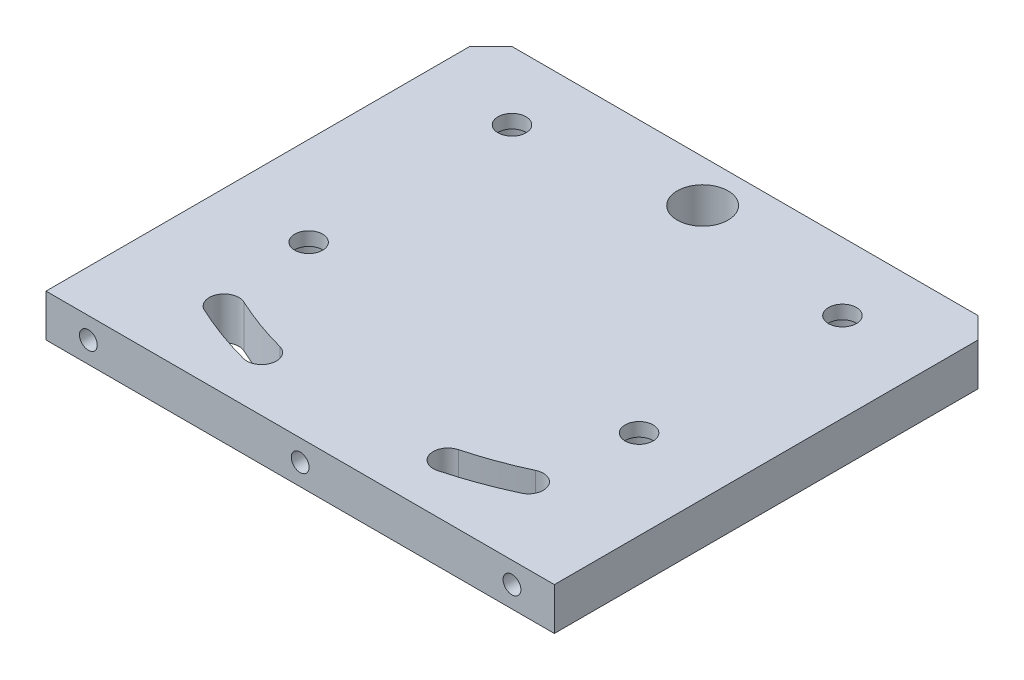
ISO-10303-21;
HEADER;
FILE_DESCRIPTION(('STEP AP214'),'2;1');
FILE_NAME('part.step','',(''),(''),'','','');
FILE_SCHEMA(('AUTOMOTIVE_DESIGN { 1 0 10303 214 1 1 1 1 }'));
ENDSEC;
DATA;
#1=APPLICATION_CONTEXT('core data for automotive mechanical design processes');
#2=APPLICATION_PROTOCOL_DEFINITION('international standard','automotive_design',2000,#1);
#3=PRODUCT_CONTEXT('',#1,'mechanical');
#4=PRODUCT('Part','Part','',(#3));
#5=PRODUCT_RELATED_PRODUCT_CATEGORY('part','',(#4));
#6=PRODUCT_DEFINITION_FORMATION('','',#4);
#7=PRODUCT_DEFINITION_CONTEXT('part definition',#1,'design');
#8=PRODUCT_DEFINITION('design','',#6,#7);
#9=PRODUCT_DEFINITION_SHAPE('','',#8);
#10=(LENGTH_UNIT() NAMED_UNIT(*) SI_UNIT(.MILLI.,.METRE.));
#11=(NAMED_UNIT(*) PLANE_ANGLE_UNIT() SI_UNIT($,.RADIAN.));
#12=(NAMED_UNIT(*) SI_UNIT($,.STERADIAN.) SOLID_ANGLE_UNIT());
#13=UNCERTAINTY_MEASURE_WITH_UNIT(LENGTH_MEASURE(1.E-05),#10,'distance_accuracy_value','');
#14=(GEOMETRIC_REPRESENTATION_CONTEXT(3) GLOBAL_UNCERTAINTY_ASSIGNED_CONTEXT((#13)) GLOBAL_UNIT_ASSIGNED_CONTEXT((#10,
#11,#12)) REPRESENTATION_CONTEXT('',''));
#15=CARTESIAN_POINT('',(0.,0.,0.));
#16=DIRECTION('',(0.,0.,1.));
#17=DIRECTION('',(1.,0.,0.));
#18=AXIS2_PLACEMENT_3D('',#15,#16,#17);
#19=CARTESIAN_POINT('',(60.,10.,52.5));
#20=DIRECTION('',(-1.,0.,0.));
#21=DIRECTION('',(0.,0.,1.));
#22=AXIS2_PLACEMENT_3D('',#19,#20,#21);
#23=PLANE('',#22);
#24=DIRECTION('',(0.,0.,-1.));
#25=VECTOR('',#24,1.);
#26=CARTESIAN_POINT('',(60.,0.,52.5));
#27=LINE('',#26,#25);
#28=CARTESIAN_POINT('',(60.,0.,52.5));
#29=VERTEX_POINT('',#28);
#30=CARTESIAN_POINT('',(60.,0.,-47.5));
#31=VERTEX_POINT('',#30);
#32=EDGE_CURVE('E294',#29,#31,#27,.T.);
#33=ORIENTED_EDGE('',*,*,#32,.T.);
#34=DIRECTION('',(0.,1.,0.));
#35=VECTOR('',#34,1.);
#36=CARTESIAN_POINT('',(60.,10.,-47.5));
#37=LINE('',#36,#35);
#38=CARTESIAN_POINT('',(60.,10.,-47.5));
#39=VERTEX_POINT('',#38);
#40=EDGE_CURVE('E11',#31,#39,#37,.T.);
#41=ORIENTED_EDGE('',*,*,#40,.T.);
#42=DIRECTION('',(0.,0.,-1.));
#43=VECTOR('',#42,1.);
#44=CARTESIAN_POINT('',(60.,10.,52.5));
#45=LINE('',#44,#43);
#46=CARTESIAN_POINT('',(60.,10.,52.5));
#47=VERTEX_POINT('',#46);
#48=EDGE_CURVE('E295',#47,#39,#45,.T.);
#49=ORIENTED_EDGE('',*,*,#48,.F.);
#50=DIRECTION('',(0.,-1.,0.));
#51=VECTOR('',#50,1.);
#52=CARTESIAN_POINT('',(60.,10.,52.5));
#53=LINE('',#52,#51);
#54=EDGE_CURVE('E304',#47,#29,#53,.T.);
#55=ORIENTED_EDGE('',*,*,#54,.T.);
#56=EDGE_LOOP('',(#33,#41,#49,#55));
#57=FACE_BOUND('',#56,.T.);
#58=ADVANCED_FACE('F39',(#57),#23,.F.);
#59=CARTESIAN_POINT('',(-60.,10.,-52.5));
#60=DIRECTION('',(0.,0.,1.));
#61=DIRECTION('',(1.,0.,0.));
#62=AXIS2_PLACEMENT_3D('',#59,#60,#61);
#63=PLANE('',#62);
#64=DIRECTION('',(-1.,0.,0.));
#65=VECTOR('',#64,1.);
#66=CARTESIAN_POINT('',(-60.,0.,-52.5));
#67=LINE('',#66,#65);
#68=CARTESIAN_POINT('',(55.,0.,-52.5));
#69=VERTEX_POINT('',#68);
#70=CARTESIAN_POINT('',(-55.,0.,-52.5));
#71=VERTEX_POINT('',#70);
#72=EDGE_CURVE('E306',#69,#71,#67,.T.);
#73=ORIENTED_EDGE('',*,*,#72,.T.);
#74=DIRECTION('',(0.,1.,0.));
#75=VECTOR('',#74,1.);
#76=CARTESIAN_POINT('',(-55.,10.,-52.5));
#77=LINE('',#76,#75);
#78=CARTESIAN_POINT('',(-55.,10.,-52.5));
#79=VERTEX_POINT('',#78);
#80=EDGE_CURVE('E60',#71,#79,#77,.T.);
#81=ORIENTED_EDGE('',*,*,#80,.T.);
#82=DIRECTION('',(-1.,0.,0.));
#83=VECTOR('',#82,1.);
#84=CARTESIAN_POINT('',(-60.,10.,-52.5));
#85=LINE('',#84,#83);
#86=CARTESIAN_POINT('',(55.,10.,-52.5));
#87=VERTEX_POINT('',#86);
#88=EDGE_CURVE('E297',#87,#79,#85,.T.);
#89=ORIENTED_EDGE('',*,*,#88,.F.);
#90=DIRECTION('',(0.,-1.,0.));
#91=VECTOR('',#90,1.);
#92=CARTESIAN_POINT('',(55.,10.,-52.5));
#93=LINE('',#92,#91);
#94=EDGE_CURVE('E323',#87,#69,#93,.T.);
#95=ORIENTED_EDGE('',*,*,#94,.T.);
#96=EDGE_LOOP('',(#73,#81,#89,#95));
#97=FACE_BOUND('',#96,.T.);
#98=ADVANCED_FACE('F344',(#97),#63,.F.);
#99=CARTESIAN_POINT('',(-60.,10.,52.5));
#100=DIRECTION('',(1.,0.,0.));
#101=DIRECTION('',(0.,0.,-1.));
#102=AXIS2_PLACEMENT_3D('',#99,#100,#101);
#103=PLANE('',#102);
#104=DIRECTION('',(0.,0.,1.));
#105=VECTOR('',#104,1.);
#106=CARTESIAN_POINT('',(-60.,10.,52.5));
#107=LINE('',#106,#105);
#108=CARTESIAN_POINT('',(-60.,10.,-47.5));
#109=VERTEX_POINT('',#108);
#110=CARTESIAN_POINT('',(-60.,10.,52.5));
#111=VERTEX_POINT('',#110);
#112=EDGE_CURVE('E300',#109,#111,#107,.T.);
#113=ORIENTED_EDGE('',*,*,#112,.F.);
#114=DIRECTION('',(0.,-1.,0.));
#115=VECTOR('',#114,1.);
#116=CARTESIAN_POINT('',(-60.,10.,-47.5));
#117=LINE('',#116,#115);
#118=CARTESIAN_POINT('',(-60.,0.,-47.5000000000001));
#119=VERTEX_POINT('',#118);
#120=EDGE_CURVE('E316',#109,#119,#117,.T.);
#121=ORIENTED_EDGE('',*,*,#120,.T.);
#122=DIRECTION('',(0.,0.,1.));
#123=VECTOR('',#122,1.);
#124=CARTESIAN_POINT('',(-60.,0.,52.5));
#125=LINE('',#124,#123);
#126=CARTESIAN_POINT('',(-60.,0.,52.5));
#127=VERTEX_POINT('',#126);
#128=EDGE_CURVE('E308',#119,#127,#125,.T.);
#129=ORIENTED_EDGE('',*,*,#128,.T.);
#130=DIRECTION('',(0.,-1.,0.));
#131=VECTOR('',#130,1.);
#132=CARTESIAN_POINT('',(-60.,10.,52.5));
#133=LINE('',#132,#131);
#134=EDGE_CURVE('E313',#111,#127,#133,.T.);
#135=ORIENTED_EDGE('',*,*,#134,.F.);
#136=EDGE_LOOP('',(#113,#121,#129,#135));
#137=FACE_BOUND('',#136,.T.);
#138=ADVANCED_FACE('F336',(#137),#103,.F.);
#139=CARTESIAN_POINT('',(-60.,10.,52.5));
#140=DIRECTION('',(0.,0.,-1.));
#141=DIRECTION('',(-1.,0.,0.));
#142=AXIS2_PLACEMENT_3D('',#139,#140,#141);
#143=PLANE('',#142);
#144=CARTESIAN_POINT('',(-50.,4.99999999999999,52.5));
#145=DIRECTION('',(0.,0.,1.));
#146=DIRECTION('',(1.,0.,0.));
#147=AXIS2_PLACEMENT_3D('',#144,#145,#146);
#148=CIRCLE('',#147,2.09999999999999);
#149=CARTESIAN_POINT('',(-47.9,4.99999999999999,52.5));
#150=VERTEX_POINT('',#149);
#151=EDGE_CURVE('E160',#150,#150,#148,.T.);
#152=ORIENTED_EDGE('',*,*,#151,.F.);
#153=EDGE_LOOP('',(#152));
#154=FACE_BOUND('',#153,.T.);
#155=CARTESIAN_POINT('',(50.,4.99999999999998,52.5));
#156=DIRECTION('',(0.,0.,1.));
#157=DIRECTION('',(1.,0.,0.));
#158=AXIS2_PLACEMENT_3D('',#155,#156,#157);
#159=CIRCLE('',#158,2.09999999999999);
#160=CARTESIAN_POINT('',(52.1,4.99999999999998,52.5));
#161=VERTEX_POINT('',#160);
#162=EDGE_CURVE('E159',#161,#161,#159,.T.);
#163=ORIENTED_EDGE('',*,*,#162,.F.);
#164=EDGE_LOOP('',(#163));
#165=FACE_BOUND('',#164,.T.);
#166=CARTESIAN_POINT('',(0.,4.99999999999999,52.5));
#167=DIRECTION('',(0.,0.,1.));
#168=DIRECTION('',(1.,0.,0.));
#169=AXIS2_PLACEMENT_3D('',#166,#167,#168);
#170=CIRCLE('',#169,2.09999999999999);
#171=CARTESIAN_POINT('',(2.09999999999999,4.99999999999999,52.5));
#172=VERTEX_POINT('',#171);
#173=EDGE_CURVE('E170',#172,#172,#170,.T.);
#174=ORIENTED_EDGE('',*,*,#173,.F.);
#175=EDGE_LOOP('',(#174));
#176=FACE_BOUND('',#175,.T.);
#177=DIRECTION('',(1.,0.,0.));
#178=VECTOR('',#177,1.);
#179=CARTESIAN_POINT('',(-60.,0.,52.5));
#180=LINE('',#179,#178);
#181=EDGE_CURVE('E298',#127,#29,#180,.T.);
#182=ORIENTED_EDGE('',*,*,#181,.T.);
#183=ORIENTED_EDGE('',*,*,#54,.F.);
#184=DIRECTION('',(1.,0.,0.));
#185=VECTOR('',#184,1.);
#186=CARTESIAN_POINT('',(-60.,10.,52.5));
#187=LINE('',#186,#185);
#188=EDGE_CURVE('E302',#111,#47,#187,.T.);
#189=ORIENTED_EDGE('',*,*,#188,.F.);
#190=ORIENTED_EDGE('',*,*,#134,.T.);
#191=EDGE_LOOP('',(#182,#183,#189,#190));
#192=FACE_BOUND('',#191,.T.);
#193=ADVANCED_FACE('F351',(#154,#165,#176,#192),#143,.F.);
#194=CARTESIAN_POINT('',(0.,10.,0.));
#195=DIRECTION('',(0.,-1.,0.));
#196=DIRECTION('',(0.,0.,-1.));
#197=AXIS2_PLACEMENT_3D('',#194,#195,#196);
#198=PLANE('',#197);
#199=CARTESIAN_POINT('',(21.9996188337143,10.,39.6036952345708));
#200=DIRECTION('',(0.,1.,0.));
#201=DIRECTION('',(0.,0.,1.));
#202=AXIS2_PLACEMENT_3D('',#199,#200,#201);
#203=CIRCLE('',#202,3.5);
#204=CARTESIAN_POINT('',(21.0937521758555,10.,36.222954842559));
#205=VERTEX_POINT('',#204);
#206=CARTESIAN_POINT('',(22.9054854915731,10.,42.9844356265825));
#207=VERTEX_POINT('',#206);
#208=EDGE_CURVE('E187',#205,#207,#203,.T.);
#209=ORIENTED_EDGE('',*,*,#208,.F.);
#210=CARTESIAN_POINT('',(0.,10.,-42.5));
#211=DIRECTION('',(0.,-1.,0.));
#212=DIRECTION('',(0.,0.,-1.));
#213=AXIS2_PLACEMENT_3D('',#210,#211,#212);
#214=CIRCLE('',#213,81.5);
#215=CARTESIAN_POINT('',(34.4433883318671,10.,31.3640846434869));
#216=VERTEX_POINT('',#215);
#217=EDGE_CURVE('E185',#216,#205,#214,.T.);
#218=ORIENTED_EDGE('',*,*,#217,.F.);
#219=CARTESIAN_POINT('',(35.9225522479595,10.,34.5361618981152));
#220=DIRECTION('',(0.,1.,0.));
#221=DIRECTION('',(0.,0.,-1.));
#222=AXIS2_PLACEMENT_3D('',#219,#220,#221);
#223=CIRCLE('',#222,3.5);
#224=CARTESIAN_POINT('',(37.401716164052,10.,37.7082391527435));
#225=VERTEX_POINT('',#224);
#226=EDGE_CURVE('E193',#225,#216,#223,.T.);
#227=ORIENTED_EDGE('',*,*,#226,.F.);
#228=CARTESIAN_POINT('',(0.,10.,-42.5));
#229=DIRECTION('',(0.,1.,0.));
#230=DIRECTION('',(0.,0.,-1.));
#231=AXIS2_PLACEMENT_3D('',#228,#229,#230);
#232=CIRCLE('',#231,88.5);
#233=EDGE_CURVE('E190',#207,#225,#232,.T.);
#234=ORIENTED_EDGE('',*,*,#233,.F.);
#235=EDGE_LOOP('',(#209,#218,#227,#234));
#236=FACE_BOUND('',#235,.T.);
#237=CARTESIAN_POINT('',(0.,10.,-42.5));
#238=DIRECTION('',(0.,-1.,0.));
#239=DIRECTION('',(0.,0.,1.));
#240=AXIS2_PLACEMENT_3D('',#237,#238,#239);
#241=CIRCLE('',#240,81.5);
#242=CARTESIAN_POINT('',(-21.0937521758555,10.,36.222954842559));
#243=VERTEX_POINT('',#242);
#244=CARTESIAN_POINT('',(-34.4433883318671,10.,31.3640846434869));
#245=VERTEX_POINT('',#244);
#246=EDGE_CURVE('E219',#243,#245,#241,.T.);
#247=ORIENTED_EDGE('',*,*,#246,.F.);
#248=CARTESIAN_POINT('',(-21.9996188337143,10.,39.6036952345708));
#249=DIRECTION('',(0.,1.,0.));
#250=DIRECTION('',(0.,0.,-1.));
#251=AXIS2_PLACEMENT_3D('',#248,#249,#250);
#252=CIRCLE('',#251,3.5);
#253=CARTESIAN_POINT('',(-22.9054854915732,10.,42.9844356265825));
#254=VERTEX_POINT('',#253);
#255=EDGE_CURVE('E217',#254,#243,#252,.T.);
#256=ORIENTED_EDGE('',*,*,#255,.F.);
#257=CARTESIAN_POINT('',(0.,10.,-42.5));
#258=DIRECTION('',(0.,1.,0.));
#259=DIRECTION('',(0.,0.,1.));
#260=AXIS2_PLACEMENT_3D('',#257,#258,#259);
#261=CIRCLE('',#260,88.5);
#262=CARTESIAN_POINT('',(-37.401716164052,10.,37.7082391527435));
#263=VERTEX_POINT('',#262);
#264=EDGE_CURVE('E225',#263,#254,#261,.T.);
#265=ORIENTED_EDGE('',*,*,#264,.F.);
#266=CARTESIAN_POINT('',(-35.9225522479595,10.,34.5361618981152));
#267=DIRECTION('',(0.,1.,0.));
#268=DIRECTION('',(0.,0.,1.));
#269=AXIS2_PLACEMENT_3D('',#266,#267,#268);
#270=CIRCLE('',#269,3.5);
#271=EDGE_CURVE('E222',#245,#263,#270,.T.);
#272=ORIENTED_EDGE('',*,*,#271,.F.);
#273=EDGE_LOOP('',(#247,#256,#265,#272));
#274=FACE_BOUND('',#273,.T.);
#275=CARTESIAN_POINT('',(0.,10.,-42.5));
#276=DIRECTION('',(0.,1.,0.));
#277=DIRECTION('',(0.,0.,1.));
#278=AXIS2_PLACEMENT_3D('',#275,#276,#277);
#279=CIRCLE('',#278,6.00000000000001);
#280=CARTESIAN_POINT('',(0.,10.,-36.5));
#281=VERTEX_POINT('',#280);
#282=EDGE_CURVE('E240',#281,#281,#279,.T.);
#283=ORIENTED_EDGE('',*,*,#282,.F.);
#284=EDGE_LOOP('',(#283));
#285=FACE_BOUND('',#284,.T.);
#286=CARTESIAN_POINT('',(-39.,10.,11.5));
#287=DIRECTION('',(0.,-1.,0.));
#288=DIRECTION('',(0.,0.,-1.));
#289=AXIS2_PLACEMENT_3D('',#286,#287,#288);
#290=CIRCLE('',#289,3.3);
#291=CARTESIAN_POINT('',(-39.,10.,8.2));
#292=VERTEX_POINT('',#291);
#293=EDGE_CURVE('E255',#292,#292,#290,.T.);
#294=ORIENTED_EDGE('',*,*,#293,.T.);
#295=EDGE_LOOP('',(#294));
#296=FACE_BOUND('',#295,.T.);
#297=CARTESIAN_POINT('',(39.,10.,11.5));
#298=DIRECTION('',(0.,-1.,0.));
#299=DIRECTION('',(0.,0.,-1.));
#300=AXIS2_PLACEMENT_3D('',#297,#298,#299);
#301=CIRCLE('',#300,3.3);
#302=CARTESIAN_POINT('',(39.,10.,8.20000000000001));
#303=VERTEX_POINT('',#302);
#304=EDGE_CURVE('E267',#303,#303,#301,.T.);
#305=ORIENTED_EDGE('',*,*,#304,.T.);
#306=EDGE_LOOP('',(#305));
#307=FACE_BOUND('',#306,.T.);
#308=CARTESIAN_POINT('',(39.,10.,-36.5));
#309=DIRECTION('',(0.,-1.,0.));
#310=DIRECTION('',(0.,0.,-1.));
#311=AXIS2_PLACEMENT_3D('',#308,#309,#310);
#312=CIRCLE('',#311,3.3);
#313=CARTESIAN_POINT('',(39.,10.,-39.8));
#314=VERTEX_POINT('',#313);
#315=EDGE_CURVE('E279',#314,#314,#312,.T.);
#316=ORIENTED_EDGE('',*,*,#315,.T.);
#317=EDGE_LOOP('',(#316));
#318=FACE_BOUND('',#317,.T.);
#319=CARTESIAN_POINT('',(-39.,10.,-36.5));
#320=DIRECTION('',(0.,-1.,0.));
#321=DIRECTION('',(0.,0.,-1.));
#322=AXIS2_PLACEMENT_3D('',#319,#320,#321);
#323=CIRCLE('',#322,3.3);
#324=CARTESIAN_POINT('',(-39.,10.,-39.8));
#325=VERTEX_POINT('',#324);
#326=EDGE_CURVE('E291',#325,#325,#323,.T.);
#327=ORIENTED_EDGE('',*,*,#326,.T.);
#328=EDGE_LOOP('',(#327));
#329=FACE_BOUND('',#328,.T.);
#330=ORIENTED_EDGE('',*,*,#88,.T.);
#331=DIRECTION('',(0.707106781186548,0.,-0.707106781186547));
#332=VECTOR('',#331,1.);
#333=CARTESIAN_POINT('',(-60.,10.,-47.5));
#334=LINE('',#333,#332);
#335=EDGE_CURVE('E47',#79,#109,#334,.F.);
#336=ORIENTED_EDGE('',*,*,#335,.T.);
#337=ORIENTED_EDGE('',*,*,#112,.T.);
#338=ORIENTED_EDGE('',*,*,#188,.T.);
#339=ORIENTED_EDGE('',*,*,#48,.T.);
#340=DIRECTION('',(0.707106781186547,0.,0.707106781186549));
#341=VECTOR('',#340,1.);
#342=CARTESIAN_POINT('',(55.,10.,-52.5));
#343=LINE('',#342,#341);
#344=EDGE_CURVE('E327',#39,#87,#343,.F.);
#345=ORIENTED_EDGE('',*,*,#344,.T.);
#346=EDGE_LOOP('',(#330,#336,#337,#338,#339,#345));
#347=FACE_BOUND('',#346,.T.);
#348=ADVANCED_FACE('F331',(#236,#274,#285,#296,#307,#318,#329,#347),#198,.F.);
#349=CARTESIAN_POINT('',(0.,0.,0.));
#350=DIRECTION('',(0.,-1.,0.));
#351=DIRECTION('',(0.,0.,-1.));
#352=AXIS2_PLACEMENT_3D('',#349,#350,#351);
#353=PLANE('',#352);
#354=CARTESIAN_POINT('',(0.,0.,-42.5));
#355=DIRECTION('',(0.,-1.,0.));
#356=DIRECTION('',(0.,0.,-1.));
#357=AXIS2_PLACEMENT_3D('',#354,#355,#356);
#358=CIRCLE('',#357,81.5);
#359=CARTESIAN_POINT('',(34.4433883318671,0.,31.3640846434869));
#360=VERTEX_POINT('',#359);
#361=CARTESIAN_POINT('',(21.0937521758555,0.,36.222954842559));
#362=VERTEX_POINT('',#361);
#363=EDGE_CURVE('E182',#360,#362,#358,.T.);
#364=ORIENTED_EDGE('',*,*,#363,.T.);
#365=CARTESIAN_POINT('',(21.9996188337143,0.,39.6036952345708));
#366=DIRECTION('',(0.,-1.,0.));
#367=DIRECTION('',(0.,0.,-1.));
#368=AXIS2_PLACEMENT_3D('',#365,#366,#367);
#369=CIRCLE('',#368,3.5);
#370=CARTESIAN_POINT('',(22.9054854915731,0.,42.9844356265825));
#371=VERTEX_POINT('',#370);
#372=EDGE_CURVE('E199',#362,#371,#369,.F.);
#373=ORIENTED_EDGE('',*,*,#372,.T.);
#374=CARTESIAN_POINT('',(0.,0.,-42.5));
#375=DIRECTION('',(0.,-1.,0.));
#376=DIRECTION('',(0.,0.,-1.));
#377=AXIS2_PLACEMENT_3D('',#374,#375,#376);
#378=CIRCLE('',#377,88.5);
#379=CARTESIAN_POINT('',(37.401716164052,0.,37.7082391527435));
#380=VERTEX_POINT('',#379);
#381=EDGE_CURVE('E176',#371,#380,#378,.F.);
#382=ORIENTED_EDGE('',*,*,#381,.T.);
#383=CARTESIAN_POINT('',(35.9225522479595,0.,34.5361618981152));
#384=DIRECTION('',(0.,-1.,0.));
#385=DIRECTION('',(0.,0.,-1.));
#386=AXIS2_PLACEMENT_3D('',#383,#384,#385);
#387=CIRCLE('',#386,3.5);
#388=EDGE_CURVE('E179',#380,#360,#387,.F.);
#389=ORIENTED_EDGE('',*,*,#388,.T.);
#390=EDGE_LOOP('',(#364,#373,#382,#389));
#391=FACE_BOUND('',#390,.T.);
#392=CARTESIAN_POINT('',(-21.9996188337143,0.,39.6036952345708));
#393=DIRECTION('',(0.,-1.,0.));
#394=DIRECTION('',(0.,0.,-1.));
#395=AXIS2_PLACEMENT_3D('',#392,#393,#394);
#396=CIRCLE('',#395,3.5);
#397=CARTESIAN_POINT('',(-22.9054854915732,0.,42.9844356265825));
#398=VERTEX_POINT('',#397);
#399=CARTESIAN_POINT('',(-21.0937521758555,0.,36.222954842559));
#400=VERTEX_POINT('',#399);
#401=EDGE_CURVE('E214',#398,#400,#396,.F.);
#402=ORIENTED_EDGE('',*,*,#401,.T.);
#403=CARTESIAN_POINT('',(0.,0.,-42.5));
#404=DIRECTION('',(0.,-1.,0.));
#405=DIRECTION('',(0.,0.,-1.));
#406=AXIS2_PLACEMENT_3D('',#403,#404,#405);
#407=CIRCLE('',#406,81.5);
#408=CARTESIAN_POINT('',(-34.4433883318671,0.,31.3640846434869));
#409=VERTEX_POINT('',#408);
#410=EDGE_CURVE('E231',#400,#409,#407,.T.);
#411=ORIENTED_EDGE('',*,*,#410,.T.);
#412=CARTESIAN_POINT('',(-35.9225522479595,0.,34.5361618981152));
#413=DIRECTION('',(0.,-1.,0.));
#414=DIRECTION('',(0.,0.,-1.));
#415=AXIS2_PLACEMENT_3D('',#412,#413,#414);
#416=CIRCLE('',#415,3.5);
#417=CARTESIAN_POINT('',(-37.401716164052,0.,37.7082391527435));
#418=VERTEX_POINT('',#417);
#419=EDGE_CURVE('E208',#409,#418,#416,.F.);
#420=ORIENTED_EDGE('',*,*,#419,.T.);
#421=CARTESIAN_POINT('',(0.,0.,-42.5));
#422=DIRECTION('',(0.,-1.,0.));
#423=DIRECTION('',(0.,0.,-1.));
#424=AXIS2_PLACEMENT_3D('',#421,#422,#423);
#425=CIRCLE('',#424,88.5);
#426=EDGE_CURVE('E211',#418,#398,#425,.F.);
#427=ORIENTED_EDGE('',*,*,#426,.T.);
#428=EDGE_LOOP('',(#402,#411,#420,#427));
#429=FACE_BOUND('',#428,.T.);
#430=CARTESIAN_POINT('',(0.,0.,-42.5));
#431=DIRECTION('',(0.,1.,0.));
#432=DIRECTION('',(0.,0.,1.));
#433=AXIS2_PLACEMENT_3D('',#430,#431,#432);
#434=CIRCLE('',#433,6.00000000000001);
#435=CARTESIAN_POINT('',(0.,0.,-36.5));
#436=VERTEX_POINT('',#435);
#437=EDGE_CURVE('E243',#436,#436,#434,.T.);
#438=ORIENTED_EDGE('',*,*,#437,.T.);
#439=EDGE_LOOP('',(#438));
#440=FACE_BOUND('',#439,.T.);
#441=CARTESIAN_POINT('',(-39.,0.,11.5));
#442=DIRECTION('',(0.,-1.,0.));
#443=DIRECTION('',(0.,0.,-1.));
#444=AXIS2_PLACEMENT_3D('',#441,#442,#443);
#445=CIRCLE('',#444,5.5);
#446=CARTESIAN_POINT('',(-39.,0.,6.));
#447=VERTEX_POINT('',#446);
#448=EDGE_CURVE('E246',#447,#447,#445,.T.);
#449=ORIENTED_EDGE('',*,*,#448,.F.);
#450=EDGE_LOOP('',(#449));
#451=FACE_BOUND('',#450,.T.);
#452=CARTESIAN_POINT('',(39.,0.,11.5));
#453=DIRECTION('',(0.,-1.,0.));
#454=DIRECTION('',(0.,0.,-1.));
#455=AXIS2_PLACEMENT_3D('',#452,#453,#454);
#456=CIRCLE('',#455,5.5);
#457=CARTESIAN_POINT('',(39.,0.,6.00000000000001));
#458=VERTEX_POINT('',#457);
#459=EDGE_CURVE('E258',#458,#458,#456,.T.);
#460=ORIENTED_EDGE('',*,*,#459,.F.);
#461=EDGE_LOOP('',(#460));
#462=FACE_BOUND('',#461,.T.);
#463=CARTESIAN_POINT('',(39.,0.,-36.5));
#464=DIRECTION('',(0.,-1.,0.));
#465=DIRECTION('',(0.,0.,-1.));
#466=AXIS2_PLACEMENT_3D('',#463,#464,#465);
#467=CIRCLE('',#466,5.5);
#468=CARTESIAN_POINT('',(39.,0.,-42.));
#469=VERTEX_POINT('',#468);
#470=EDGE_CURVE('E270',#469,#469,#467,.T.);
#471=ORIENTED_EDGE('',*,*,#470,.F.);
#472=EDGE_LOOP('',(#471));
#473=FACE_BOUND('',#472,.T.);
#474=CARTESIAN_POINT('',(-39.,0.,-36.5));
#475=DIRECTION('',(0.,-1.,0.));
#476=DIRECTION('',(0.,0.,-1.));
#477=AXIS2_PLACEMENT_3D('',#474,#475,#476);
#478=CIRCLE('',#477,5.5);
#479=CARTESIAN_POINT('',(-39.,0.,-42.));
#480=VERTEX_POINT('',#479);
#481=EDGE_CURVE('E282',#480,#480,#478,.T.);
#482=ORIENTED_EDGE('',*,*,#481,.F.);
#483=EDGE_LOOP('',(#482));
#484=FACE_BOUND('',#483,.T.);
#485=ORIENTED_EDGE('',*,*,#128,.F.);
#486=DIRECTION('',(-0.707106781186548,0.,0.707106781186547));
#487=VECTOR('',#486,1.);
#488=CARTESIAN_POINT('',(-53.7499999999999,0.,-53.7500000000001));
#489=LINE('',#488,#487);
#490=EDGE_CURVE('E321',#119,#71,#489,.F.);
#491=ORIENTED_EDGE('',*,*,#490,.T.);
#492=ORIENTED_EDGE('',*,*,#72,.F.);
#493=DIRECTION('',(-0.707106781186547,0.,-0.707106781186549));
#494=VECTOR('',#493,1.);
#495=CARTESIAN_POINT('',(53.7500000000001,0.,-53.7499999999999));
#496=LINE('',#495,#494);
#497=EDGE_CURVE('E319',#69,#31,#496,.F.);
#498=ORIENTED_EDGE('',*,*,#497,.T.);
#499=ORIENTED_EDGE('',*,*,#32,.F.);
#500=ORIENTED_EDGE('',*,*,#181,.F.);
#501=EDGE_LOOP('',(#485,#491,#492,#498,#499,#500));
#502=FACE_BOUND('',#501,.T.);
#503=ADVANCED_FACE('F342',(#391,#429,#440,#451,#462,#473,#484,#502),#353,.T.);
#504=CARTESIAN_POINT('',(-39.,0.,-36.5));
#505=DIRECTION('',(0.,-1.,0.));
#506=DIRECTION('',(0.,0.,-1.));
#507=AXIS2_PLACEMENT_3D('',#504,#505,#506);
#508=CYLINDRICAL_SURFACE('',#507,3.3);
#509=ORIENTED_EDGE('',*,*,#326,.F.);
#510=EDGE_LOOP('',(#509));
#511=FACE_BOUND('',#510,.T.);
#512=CARTESIAN_POINT('',(-39.,6.8,-36.5));
#513=DIRECTION('',(0.,-1.,0.));
#514=DIRECTION('',(0.,0.,-1.));
#515=AXIS2_PLACEMENT_3D('',#512,#513,#514);
#516=CIRCLE('',#515,3.3);
#517=CARTESIAN_POINT('',(-39.,6.8,-39.8));
#518=VERTEX_POINT('',#517);
#519=EDGE_CURVE('E288',#518,#518,#516,.T.);
#520=ORIENTED_EDGE('',*,*,#519,.T.);
#521=EDGE_LOOP('',(#520));
#522=FACE_BOUND('',#521,.T.);
#523=ADVANCED_FACE('F475',(#511,#522),#508,.F.);
#524=CARTESIAN_POINT('',(-35.7,6.8,-36.5));
#525=DIRECTION('',(0.,1.,0.));
#526=DIRECTION('',(0.,0.,1.));
#527=AXIS2_PLACEMENT_3D('',#524,#525,#526);
#528=PLANE('',#527);
#529=ORIENTED_EDGE('',*,*,#519,.F.);
#530=EDGE_LOOP('',(#529));
#531=FACE_BOUND('',#530,.T.);
#532=CARTESIAN_POINT('',(-39.,6.8,-36.5));
#533=DIRECTION('',(0.,-1.,0.));
#534=DIRECTION('',(0.,0.,-1.));
#535=AXIS2_PLACEMENT_3D('',#532,#533,#534);
#536=CIRCLE('',#535,5.5);
#537=CARTESIAN_POINT('',(-39.,6.8,-42.));
#538=VERTEX_POINT('',#537);
#539=EDGE_CURVE('E285',#538,#538,#536,.T.);
#540=ORIENTED_EDGE('',*,*,#539,.T.);
#541=EDGE_LOOP('',(#540));
#542=FACE_BOUND('',#541,.T.);
#543=ADVANCED_FACE('F471',(#531,#542),#528,.F.);
#544=CARTESIAN_POINT('',(-39.,0.,-36.5));
#545=DIRECTION('',(0.,-1.,0.));
#546=DIRECTION('',(0.,0.,-1.));
#547=AXIS2_PLACEMENT_3D('',#544,#545,#546);
#548=CYLINDRICAL_SURFACE('',#547,5.5);
#549=ORIENTED_EDGE('',*,*,#539,.F.);
#550=EDGE_LOOP('',(#549));
#551=FACE_BOUND('',#550,.T.);
#552=ORIENTED_EDGE('',*,*,#481,.T.);
#553=EDGE_LOOP('',(#552));
#554=FACE_BOUND('',#553,.T.);
#555=ADVANCED_FACE('F467',(#551,#554),#548,.F.);
#556=CARTESIAN_POINT('',(39.,0.,-36.5));
#557=DIRECTION('',(0.,-1.,0.));
#558=DIRECTION('',(0.,0.,-1.));
#559=AXIS2_PLACEMENT_3D('',#556,#557,#558);
#560=CYLINDRICAL_SURFACE('',#559,3.3);
#561=ORIENTED_EDGE('',*,*,#315,.F.);
#562=EDGE_LOOP('',(#561));
#563=FACE_BOUND('',#562,.T.);
#564=CARTESIAN_POINT('',(39.,6.8,-36.5));
#565=DIRECTION('',(0.,-1.,0.));
#566=DIRECTION('',(0.,0.,-1.));
#567=AXIS2_PLACEMENT_3D('',#564,#565,#566);
#568=CIRCLE('',#567,3.3);
#569=CARTESIAN_POINT('',(39.,6.8,-39.8));
#570=VERTEX_POINT('',#569);
#571=EDGE_CURVE('E276',#570,#570,#568,.T.);
#572=ORIENTED_EDGE('',*,*,#571,.T.);
#573=EDGE_LOOP('',(#572));
#574=FACE_BOUND('',#573,.T.);
#575=ADVANCED_FACE('F463',(#563,#574),#560,.F.);
#576=CARTESIAN_POINT('',(42.3,6.8,-36.5));
#577=DIRECTION('',(0.,1.,0.));
#578=DIRECTION('',(0.,0.,1.));
#579=AXIS2_PLACEMENT_3D('',#576,#577,#578);
#580=PLANE('',#579);
#581=ORIENTED_EDGE('',*,*,#571,.F.);
#582=EDGE_LOOP('',(#581));
#583=FACE_BOUND('',#582,.T.);
#584=CARTESIAN_POINT('',(39.,6.8,-36.5));
#585=DIRECTION('',(0.,-1.,0.));
#586=DIRECTION('',(0.,0.,-1.));
#587=AXIS2_PLACEMENT_3D('',#584,#585,#586);
#588=CIRCLE('',#587,5.5);
#589=CARTESIAN_POINT('',(39.,6.8,-42.));
#590=VERTEX_POINT('',#589);
#591=EDGE_CURVE('E273',#590,#590,#588,.T.);
#592=ORIENTED_EDGE('',*,*,#591,.T.);
#593=EDGE_LOOP('',(#592));
#594=FACE_BOUND('',#593,.T.);
#595=ADVANCED_FACE('F459',(#583,#594),#580,.F.);
#596=CARTESIAN_POINT('',(39.,0.,-36.5));
#597=DIRECTION('',(0.,-1.,0.));
#598=DIRECTION('',(0.,0.,-1.));
#599=AXIS2_PLACEMENT_3D('',#596,#597,#598);
#600=CYLINDRICAL_SURFACE('',#599,5.5);
#601=ORIENTED_EDGE('',*,*,#591,.F.);
#602=EDGE_LOOP('',(#601));
#603=FACE_BOUND('',#602,.T.);
#604=ORIENTED_EDGE('',*,*,#470,.T.);
#605=EDGE_LOOP('',(#604));
#606=FACE_BOUND('',#605,.T.);
#607=ADVANCED_FACE('F455',(#603,#606),#600,.F.);
#608=CARTESIAN_POINT('',(39.,0.,11.5));
#609=DIRECTION('',(0.,-1.,0.));
#610=DIRECTION('',(0.,0.,-1.));
#611=AXIS2_PLACEMENT_3D('',#608,#609,#610);
#612=CYLINDRICAL_SURFACE('',#611,3.3);
#613=ORIENTED_EDGE('',*,*,#304,.F.);
#614=EDGE_LOOP('',(#613));
#615=FACE_BOUND('',#614,.T.);
#616=CARTESIAN_POINT('',(39.,6.8,11.5));
#617=DIRECTION('',(0.,-1.,0.));
#618=DIRECTION('',(0.,0.,-1.));
#619=AXIS2_PLACEMENT_3D('',#616,#617,#618);
#620=CIRCLE('',#619,3.3);
#621=CARTESIAN_POINT('',(39.,6.8,8.20000000000001));
#622=VERTEX_POINT('',#621);
#623=EDGE_CURVE('E264',#622,#622,#620,.T.);
#624=ORIENTED_EDGE('',*,*,#623,.T.);
#625=EDGE_LOOP('',(#624));
#626=FACE_BOUND('',#625,.T.);
#627=ADVANCED_FACE('F451',(#615,#626),#612,.F.);
#628=CARTESIAN_POINT('',(42.3,6.8,11.5));
#629=DIRECTION('',(0.,1.,0.));
#630=DIRECTION('',(0.,0.,1.));
#631=AXIS2_PLACEMENT_3D('',#628,#629,#630);
#632=PLANE('',#631);
#633=ORIENTED_EDGE('',*,*,#623,.F.);
#634=EDGE_LOOP('',(#633));
#635=FACE_BOUND('',#634,.T.);
#636=CARTESIAN_POINT('',(39.,6.8,11.5));
#637=DIRECTION('',(0.,-1.,0.));
#638=DIRECTION('',(0.,0.,-1.));
#639=AXIS2_PLACEMENT_3D('',#636,#637,#638);
#640=CIRCLE('',#639,5.5);
#641=CARTESIAN_POINT('',(39.,6.8,6.00000000000001));
#642=VERTEX_POINT('',#641);
#643=EDGE_CURVE('E261',#642,#642,#640,.T.);
#644=ORIENTED_EDGE('',*,*,#643,.T.);
#645=EDGE_LOOP('',(#644));
#646=FACE_BOUND('',#645,.T.);
#647=ADVANCED_FACE('F447',(#635,#646),#632,.F.);
#648=CARTESIAN_POINT('',(39.,0.,11.5));
#649=DIRECTION('',(0.,-1.,0.));
#650=DIRECTION('',(0.,0.,-1.));
#651=AXIS2_PLACEMENT_3D('',#648,#649,#650);
#652=CYLINDRICAL_SURFACE('',#651,5.5);
#653=ORIENTED_EDGE('',*,*,#643,.F.);
#654=EDGE_LOOP('',(#653));
#655=FACE_BOUND('',#654,.T.);
#656=ORIENTED_EDGE('',*,*,#459,.T.);
#657=EDGE_LOOP('',(#656));
#658=FACE_BOUND('',#657,.T.);
#659=ADVANCED_FACE('F443',(#655,#658),#652,.F.);
#660=CARTESIAN_POINT('',(-39.,0.,11.5));
#661=DIRECTION('',(0.,-1.,0.));
#662=DIRECTION('',(0.,0.,-1.));
#663=AXIS2_PLACEMENT_3D('',#660,#661,#662);
#664=CYLINDRICAL_SURFACE('',#663,3.3);
#665=ORIENTED_EDGE('',*,*,#293,.F.);
#666=EDGE_LOOP('',(#665));
#667=FACE_BOUND('',#666,.T.);
#668=CARTESIAN_POINT('',(-39.,6.8,11.5));
#669=DIRECTION('',(0.,-1.,0.));
#670=DIRECTION('',(0.,0.,-1.));
#671=AXIS2_PLACEMENT_3D('',#668,#669,#670);
#672=CIRCLE('',#671,3.3);
#673=CARTESIAN_POINT('',(-39.,6.8,8.2));
#674=VERTEX_POINT('',#673);
#675=EDGE_CURVE('E252',#674,#674,#672,.T.);
#676=ORIENTED_EDGE('',*,*,#675,.T.);
#677=EDGE_LOOP('',(#676));
#678=FACE_BOUND('',#677,.T.);
#679=ADVANCED_FACE('F439',(#667,#678),#664,.F.);
#680=CARTESIAN_POINT('',(-35.7,6.8,11.5));
#681=DIRECTION('',(0.,1.,0.));
#682=DIRECTION('',(0.,0.,1.));
#683=AXIS2_PLACEMENT_3D('',#680,#681,#682);
#684=PLANE('',#683);
#685=ORIENTED_EDGE('',*,*,#675,.F.);
#686=EDGE_LOOP('',(#685));
#687=FACE_BOUND('',#686,.T.);
#688=CARTESIAN_POINT('',(-39.,6.8,11.5));
#689=DIRECTION('',(0.,-1.,0.));
#690=DIRECTION('',(0.,0.,-1.));
#691=AXIS2_PLACEMENT_3D('',#688,#689,#690);
#692=CIRCLE('',#691,5.5);
#693=CARTESIAN_POINT('',(-39.,6.8,6.));
#694=VERTEX_POINT('',#693);
#695=EDGE_CURVE('E249',#694,#694,#692,.T.);
#696=ORIENTED_EDGE('',*,*,#695,.T.);
#697=EDGE_LOOP('',(#696));
#698=FACE_BOUND('',#697,.T.);
#699=ADVANCED_FACE('F435',(#687,#698),#684,.F.);
#700=CARTESIAN_POINT('',(-39.,0.,11.5));
#701=DIRECTION('',(0.,-1.,0.));
#702=DIRECTION('',(0.,0.,-1.));
#703=AXIS2_PLACEMENT_3D('',#700,#701,#702);
#704=CYLINDRICAL_SURFACE('',#703,5.5);
#705=ORIENTED_EDGE('',*,*,#695,.F.);
#706=EDGE_LOOP('',(#705));
#707=FACE_BOUND('',#706,.T.);
#708=ORIENTED_EDGE('',*,*,#448,.T.);
#709=EDGE_LOOP('',(#708));
#710=FACE_BOUND('',#709,.T.);
#711=ADVANCED_FACE('F431',(#707,#710),#704,.F.);
#712=CARTESIAN_POINT('',(0.,10.,-42.5));
#713=DIRECTION('',(0.,1.,0.));
#714=DIRECTION('',(0.,0.,1.));
#715=AXIS2_PLACEMENT_3D('',#712,#713,#714);
#716=CYLINDRICAL_SURFACE('',#715,6.00000000000001);
#717=ORIENTED_EDGE('',*,*,#437,.F.);
#718=EDGE_LOOP('',(#717));
#719=FACE_BOUND('',#718,.T.);
#720=ORIENTED_EDGE('',*,*,#282,.T.);
#721=EDGE_LOOP('',(#720));
#722=FACE_BOUND('',#721,.T.);
#723=ADVANCED_FACE('F427',(#719,#722),#716,.F.);
#724=CARTESIAN_POINT('',(-21.9996188337143,-0.000999999999999265,39.6036952345708));
#725=DIRECTION('',(0.,1.,0.));
#726=DIRECTION('',(0.,0.,1.));
#727=AXIS2_PLACEMENT_3D('',#724,#725,#726);
#728=CYLINDRICAL_SURFACE('',#727,3.5);
#729=DIRECTION('',(0.,1.,0.));
#730=VECTOR('',#729,1.);
#731=CARTESIAN_POINT('',(-22.9054854915732,-0.000999999999999265,42.9844356265825));
#732=LINE('',#731,#730);
#733=EDGE_CURVE('E229',#398,#254,#732,.T.);
#734=ORIENTED_EDGE('',*,*,#733,.T.);
#735=ORIENTED_EDGE('',*,*,#255,.T.);
#736=DIRECTION('',(0.,1.,0.));
#737=VECTOR('',#736,1.);
#738=CARTESIAN_POINT('',(-21.0937521758555,-0.000999999999999265,36.222954842559));
#739=LINE('',#738,#737);
#740=EDGE_CURVE('E228',#400,#243,#739,.T.);
#741=ORIENTED_EDGE('',*,*,#740,.F.);
#742=ORIENTED_EDGE('',*,*,#401,.F.);
#743=EDGE_LOOP('',(#734,#735,#741,#742));
#744=FACE_BOUND('',#743,.T.);
#745=ADVANCED_FACE('F417',(#744),#728,.F.);
#746=CARTESIAN_POINT('',(0.,-0.000999999999999265,-42.5));
#747=DIRECTION('',(0.,1.,0.));
#748=DIRECTION('',(0.,0.,1.));
#749=AXIS2_PLACEMENT_3D('',#746,#747,#748);
#750=CYLINDRICAL_SURFACE('',#749,88.5);
#751=DIRECTION('',(0.,1.,0.));
#752=VECTOR('',#751,1.);
#753=CARTESIAN_POINT('',(-37.401716164052,-0.000999999999999265,37.7082391527435));
#754=LINE('',#753,#752);
#755=EDGE_CURVE('E232',#418,#263,#754,.T.);
#756=ORIENTED_EDGE('',*,*,#755,.T.);
#757=ORIENTED_EDGE('',*,*,#264,.T.);
#758=ORIENTED_EDGE('',*,*,#733,.F.);
#759=ORIENTED_EDGE('',*,*,#426,.F.);
#760=EDGE_LOOP('',(#756,#757,#758,#759));
#761=FACE_BOUND('',#760,.T.);
#762=ADVANCED_FACE('F413',(#761),#750,.F.);
#763=CARTESIAN_POINT('',(-35.9225522479595,-0.000999999999999265,34.5361618981152));
#764=DIRECTION('',(0.,1.,0.));
#765=DIRECTION('',(0.,0.,1.));
#766=AXIS2_PLACEMENT_3D('',#763,#764,#765);
#767=CYLINDRICAL_SURFACE('',#766,3.5);
#768=DIRECTION('',(0.,1.,0.));
#769=VECTOR('',#768,1.);
#770=CARTESIAN_POINT('',(-34.4433883318671,-0.000999999999999265,31.3640846434869));
#771=LINE('',#770,#769);
#772=EDGE_CURVE('E234',#409,#245,#771,.T.);
#773=ORIENTED_EDGE('',*,*,#772,.T.);
#774=ORIENTED_EDGE('',*,*,#271,.T.);
#775=ORIENTED_EDGE('',*,*,#755,.F.);
#776=ORIENTED_EDGE('',*,*,#419,.F.);
#777=EDGE_LOOP('',(#773,#774,#775,#776));
#778=FACE_BOUND('',#777,.T.);
#779=ADVANCED_FACE('F416',(#778),#767,.F.);
#780=CARTESIAN_POINT('',(0.,-0.000999999999999265,-42.5));
#781=DIRECTION('',(0.,1.,0.));
#782=DIRECTION('',(0.,0.,1.));
#783=AXIS2_PLACEMENT_3D('',#780,#781,#782);
#784=CYLINDRICAL_SURFACE('',#783,81.5);
#785=ORIENTED_EDGE('',*,*,#740,.T.);
#786=ORIENTED_EDGE('',*,*,#246,.T.);
#787=ORIENTED_EDGE('',*,*,#772,.F.);
#788=ORIENTED_EDGE('',*,*,#410,.F.);
#789=EDGE_LOOP('',(#785,#786,#787,#788));
#790=FACE_BOUND('',#789,.T.);
#791=ADVANCED_FACE('F411',(#790),#784,.T.);
#792=CARTESIAN_POINT('',(0.,-0.000999999999999265,-42.5));
#793=DIRECTION('',(0.,1.,0.));
#794=DIRECTION('',(0.,0.,1.));
#795=AXIS2_PLACEMENT_3D('',#792,#793,#794);
#796=CYLINDRICAL_SURFACE('',#795,81.5);
#797=DIRECTION('',(0.,1.,0.));
#798=VECTOR('',#797,1.);
#799=CARTESIAN_POINT('',(34.4433883318671,-0.000999999999999265,31.3640846434869));
#800=LINE('',#799,#798);
#801=EDGE_CURVE('E197',#360,#216,#800,.T.);
#802=ORIENTED_EDGE('',*,*,#801,.T.);
#803=ORIENTED_EDGE('',*,*,#217,.T.);
#804=DIRECTION('',(0.,1.,0.));
#805=VECTOR('',#804,1.);
#806=CARTESIAN_POINT('',(21.0937521758555,-0.000999999999999265,36.222954842559));
#807=LINE('',#806,#805);
#808=EDGE_CURVE('E196',#362,#205,#807,.T.);
#809=ORIENTED_EDGE('',*,*,#808,.F.);
#810=ORIENTED_EDGE('',*,*,#363,.F.);
#811=EDGE_LOOP('',(#802,#803,#809,#810));
#812=FACE_BOUND('',#811,.T.);
#813=ADVANCED_FACE('F401',(#812),#796,.T.);
#814=CARTESIAN_POINT('',(35.9225522479595,-0.000999999999999265,34.5361618981152));
#815=DIRECTION('',(0.,1.,0.));
#816=DIRECTION('',(0.,0.,1.));
#817=AXIS2_PLACEMENT_3D('',#814,#815,#816);
#818=CYLINDRICAL_SURFACE('',#817,3.5);
#819=DIRECTION('',(0.,1.,0.));
#820=VECTOR('',#819,1.);
#821=CARTESIAN_POINT('',(37.401716164052,-0.000999999999999265,37.7082391527435));
#822=LINE('',#821,#820);
#823=EDGE_CURVE('E200',#380,#225,#822,.T.);
#824=ORIENTED_EDGE('',*,*,#823,.T.);
#825=ORIENTED_EDGE('',*,*,#226,.T.);
#826=ORIENTED_EDGE('',*,*,#801,.F.);
#827=ORIENTED_EDGE('',*,*,#388,.F.);
#828=EDGE_LOOP('',(#824,#825,#826,#827));
#829=FACE_BOUND('',#828,.T.);
#830=ADVANCED_FACE('F397',(#829),#818,.F.);
#831=CARTESIAN_POINT('',(0.,-0.000999999999999265,-42.5));
#832=DIRECTION('',(0.,1.,0.));
#833=DIRECTION('',(0.,0.,1.));
#834=AXIS2_PLACEMENT_3D('',#831,#832,#833);
#835=CYLINDRICAL_SURFACE('',#834,88.5);
#836=DIRECTION('',(0.,1.,0.));
#837=VECTOR('',#836,1.);
#838=CARTESIAN_POINT('',(22.9054854915731,-0.000999999999999265,42.9844356265825));
#839=LINE('',#838,#837);
#840=EDGE_CURVE('E202',#371,#207,#839,.T.);
#841=ORIENTED_EDGE('',*,*,#840,.T.);
#842=ORIENTED_EDGE('',*,*,#233,.T.);
#843=ORIENTED_EDGE('',*,*,#823,.F.);
#844=ORIENTED_EDGE('',*,*,#381,.F.);
#845=EDGE_LOOP('',(#841,#842,#843,#844));
#846=FACE_BOUND('',#845,.T.);
#847=ADVANCED_FACE('F400',(#846),#835,.F.);
#848=CARTESIAN_POINT('',(21.9996188337143,-0.000999999999999265,39.6036952345708));
#849=DIRECTION('',(0.,1.,0.));
#850=DIRECTION('',(0.,0.,1.));
#851=AXIS2_PLACEMENT_3D('',#848,#849,#850);
#852=CYLINDRICAL_SURFACE('',#851,3.5);
#853=ORIENTED_EDGE('',*,*,#808,.T.);
#854=ORIENTED_EDGE('',*,*,#208,.T.);
#855=ORIENTED_EDGE('',*,*,#840,.F.);
#856=ORIENTED_EDGE('',*,*,#372,.F.);
#857=EDGE_LOOP('',(#853,#854,#855,#856));
#858=FACE_BOUND('',#857,.T.);
#859=ADVANCED_FACE('F395',(#858),#852,.F.);
#860=CARTESIAN_POINT('',(0.,4.99999999999999,42.1));
#861=DIRECTION('',(0.,0.,1.));
#862=DIRECTION('',(1.,0.,0.));
#863=AXIS2_PLACEMENT_3D('',#860,#861,#862);
#864=CONICAL_SURFACE('',#863,2.09999999999999,1.02974425867665);
#865=CARTESIAN_POINT('',(0.,4.99999999999999,40.8381927000421));
#866=VERTEX_POINT('',#865);
#867=VERTEX_LOOP('',#866);
#868=FACE_BOUND('',#867,.T.);
#869=CARTESIAN_POINT('',(0.,4.99999999999999,42.1));
#870=DIRECTION('',(0.,0.,1.));
#871=DIRECTION('',(1.,0.,0.));
#872=AXIS2_PLACEMENT_3D('',#869,#870,#871);
#873=CIRCLE('',#872,2.09999999999999);
#874=CARTESIAN_POINT('',(2.09999999999999,4.99999999999999,42.1));
#875=VERTEX_POINT('',#874);
#876=EDGE_CURVE('E173',#875,#875,#873,.T.);
#877=ORIENTED_EDGE('',*,*,#876,.T.);
#878=EDGE_LOOP('',(#877));
#879=FACE_BOUND('',#878,.T.);
#880=ADVANCED_FACE('F391',(#868,#879),#864,.F.);
#881=CARTESIAN_POINT('',(0.,4.99999999999999,52.5));
#882=DIRECTION('',(0.,0.,1.));
#883=DIRECTION('',(1.,0.,0.));
#884=AXIS2_PLACEMENT_3D('',#881,#882,#883);
#885=CYLINDRICAL_SURFACE('',#884,2.09999999999999);
#886=ORIENTED_EDGE('',*,*,#876,.F.);
#887=EDGE_LOOP('',(#886));
#888=FACE_BOUND('',#887,.T.);
#889=ORIENTED_EDGE('',*,*,#173,.T.);
#890=EDGE_LOOP('',(#889));
#891=FACE_BOUND('',#890,.T.);
#892=ADVANCED_FACE('F387',(#888,#891),#885,.F.);
#893=CARTESIAN_POINT('',(50.,4.99999999999998,42.1));
#894=DIRECTION('',(0.,0.,1.));
#895=DIRECTION('',(1.,0.,0.));
#896=AXIS2_PLACEMENT_3D('',#893,#894,#895);
#897=CONICAL_SURFACE('',#896,2.09999999999999,1.02974425867666);
#898=CARTESIAN_POINT('',(50.,4.99999999999998,40.8381927000421));
#899=VERTEX_POINT('',#898);
#900=VERTEX_LOOP('',#899);
#901=FACE_BOUND('',#900,.T.);
#902=CARTESIAN_POINT('',(50.,4.99999999999998,42.1));
#903=DIRECTION('',(0.,0.,1.));
#904=DIRECTION('',(1.,0.,0.));
#905=AXIS2_PLACEMENT_3D('',#902,#903,#904);
#906=CIRCLE('',#905,2.09999999999999);
#907=CARTESIAN_POINT('',(52.1,4.99999999999998,42.1));
#908=VERTEX_POINT('',#907);
#909=EDGE_CURVE('E163',#908,#908,#906,.T.);
#910=ORIENTED_EDGE('',*,*,#909,.T.);
#911=EDGE_LOOP('',(#910));
#912=FACE_BOUND('',#911,.T.);
#913=ADVANCED_FACE('F383',(#901,#912),#897,.F.);
#914=CARTESIAN_POINT('',(50.,4.99999999999998,52.5));
#915=DIRECTION('',(0.,0.,1.));
#916=DIRECTION('',(1.,0.,0.));
#917=AXIS2_PLACEMENT_3D('',#914,#915,#916);
#918=CYLINDRICAL_SURFACE('',#917,2.09999999999999);
#919=ORIENTED_EDGE('',*,*,#909,.F.);
#920=EDGE_LOOP('',(#919));
#921=FACE_BOUND('',#920,.T.);
#922=ORIENTED_EDGE('',*,*,#162,.T.);
#923=EDGE_LOOP('',(#922));
#924=FACE_BOUND('',#923,.T.);
#925=ADVANCED_FACE('F153',(#921,#924),#918,.F.);
#926=CARTESIAN_POINT('',(-50.,4.99999999999999,42.1));
#927=DIRECTION('',(0.,0.,1.));
#928=DIRECTION('',(1.,0.,0.));
#929=AXIS2_PLACEMENT_3D('',#926,#927,#928);
#930=CONICAL_SURFACE('',#929,2.09999999999999,1.02974425867666);
#931=CARTESIAN_POINT('',(-50.,4.99999999999999,40.8381927000421));
#932=VERTEX_POINT('',#931);
#933=VERTEX_LOOP('',#932);
#934=FACE_BOUND('',#933,.T.);
#935=CARTESIAN_POINT('',(-50.,4.99999999999999,42.1));
#936=DIRECTION('',(0.,0.,1.));
#937=DIRECTION('',(1.,0.,0.));
#938=AXIS2_PLACEMENT_3D('',#935,#936,#937);
#939=CIRCLE('',#938,2.09999999999999);
#940=CARTESIAN_POINT('',(-47.9,4.99999999999999,42.1));
#941=VERTEX_POINT('',#940);
#942=EDGE_CURVE('E157',#941,#941,#939,.T.);
#943=ORIENTED_EDGE('',*,*,#942,.T.);
#944=EDGE_LOOP('',(#943));
#945=FACE_BOUND('',#944,.T.);
#946=ADVANCED_FACE('F149',(#934,#945),#930,.F.);
#947=CARTESIAN_POINT('',(-50.,4.99999999999999,52.5));
#948=DIRECTION('',(0.,0.,1.));
#949=DIRECTION('',(1.,0.,0.));
#950=AXIS2_PLACEMENT_3D('',#947,#948,#949);
#951=CYLINDRICAL_SURFACE('',#950,2.09999999999999);
#952=ORIENTED_EDGE('',*,*,#942,.F.);
#953=EDGE_LOOP('',(#952));
#954=FACE_BOUND('',#953,.T.);
#955=ORIENTED_EDGE('',*,*,#151,.T.);
#956=EDGE_LOOP('',(#955));
#957=FACE_BOUND('',#956,.T.);
#958=ADVANCED_FACE('F152',(#954,#957),#951,.F.);
#959=CARTESIAN_POINT('',(-60.,10.,-47.5));
#960=DIRECTION('',(0.707106781186547,0.,0.707106781186548));
#961=DIRECTION('',(0.,-1.,0.));
#962=AXIS2_PLACEMENT_3D('',#959,#960,#961);
#963=PLANE('',#962);
#964=ORIENTED_EDGE('',*,*,#335,.F.);
#965=ORIENTED_EDGE('',*,*,#80,.F.);
#966=ORIENTED_EDGE('',*,*,#490,.F.);
#967=ORIENTED_EDGE('',*,*,#120,.F.);
#968=EDGE_LOOP('',(#964,#965,#966,#967));
#969=FACE_BOUND('',#968,.T.);
#970=ADVANCED_FACE('F339',(#969),#963,.F.);
#971=CARTESIAN_POINT('',(55.,10.,-52.5));
#972=DIRECTION('',(-0.707106781186548,0.,0.707106781186546));
#973=DIRECTION('',(0.,-1.,0.));
#974=AXIS2_PLACEMENT_3D('',#971,#972,#973);
#975=PLANE('',#974);
#976=ORIENTED_EDGE('',*,*,#344,.F.);
#977=ORIENTED_EDGE('',*,*,#40,.F.);
#978=ORIENTED_EDGE('',*,*,#497,.F.);
#979=ORIENTED_EDGE('',*,*,#94,.F.);
#980=EDGE_LOOP('',(#976,#977,#978,#979));
#981=FACE_BOUND('',#980,.T.);
#982=ADVANCED_FACE('F41',(#981),#975,.F.);
#983=CLOSED_SHELL('',(#58,#98,#138,#193,#348,#503,#523,#543,#555,#575,#595,#607,#627,#647,#659,
#679,#699,#711,#723,#745,#762,#779,#791,#813,#830,#847,#859,#880,#892,#913,#925,#946,#958,#970,#982));
#984=MANIFOLD_SOLID_BREP('B2',#983);
#985=ADVANCED_BREP_SHAPE_REPRESENTATION('',(#18,#984),#14);
#986=SHAPE_DEFINITION_REPRESENTATION(#9,#985);
ENDSEC;
END-ISO-10303-21;
